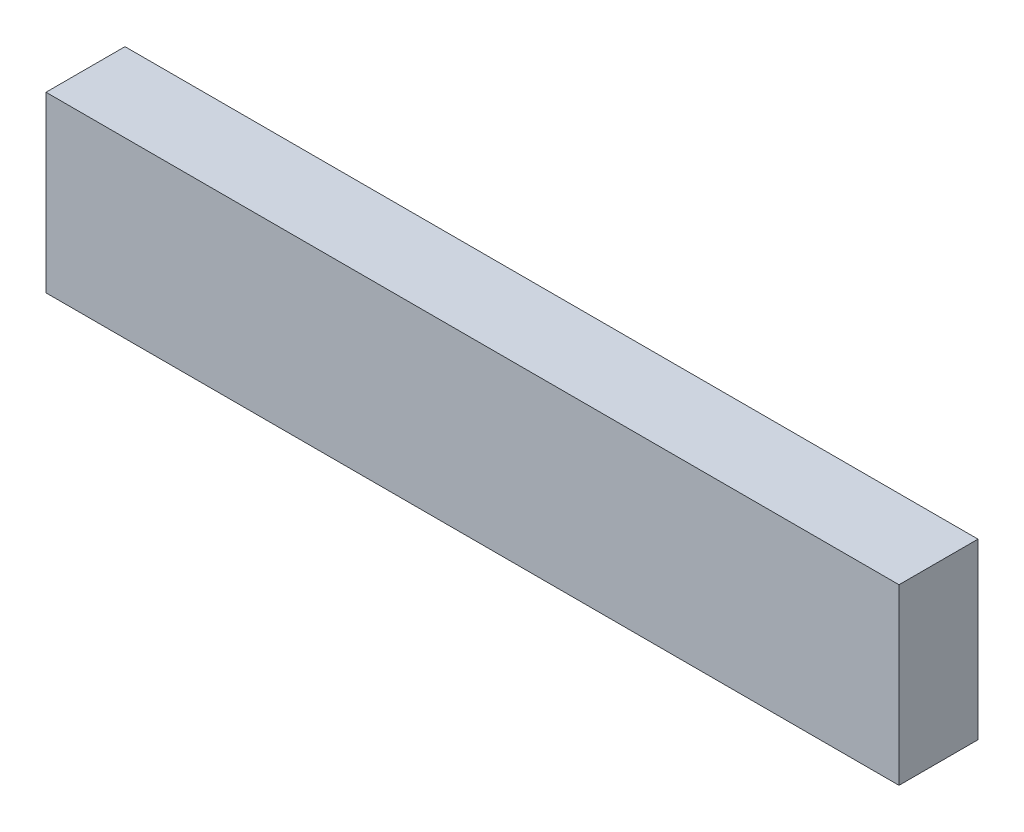
ISO-10303-21;
HEADER;
FILE_DESCRIPTION(('STEP AP214'),'2;1');
FILE_NAME('part.step','',(''),(''),'','','');
FILE_SCHEMA(('AUTOMOTIVE_DESIGN { 1 0 10303 214 1 1 1 1 }'));
ENDSEC;
DATA;
#1=APPLICATION_CONTEXT('core data for automotive mechanical design processes');
#2=APPLICATION_PROTOCOL_DEFINITION('international standard','automotive_design',2000,#1);
#3=PRODUCT_CONTEXT('',#1,'mechanical');
#4=PRODUCT('Part','Part','',(#3));
#5=PRODUCT_RELATED_PRODUCT_CATEGORY('part','',(#4));
#6=PRODUCT_DEFINITION_FORMATION('','',#4);
#7=PRODUCT_DEFINITION_CONTEXT('part definition',#1,'design');
#8=PRODUCT_DEFINITION('design','',#6,#7);
#9=PRODUCT_DEFINITION_SHAPE('','',#8);
#10=(LENGTH_UNIT() NAMED_UNIT(*) SI_UNIT(.MILLI.,.METRE.));
#11=(NAMED_UNIT(*) PLANE_ANGLE_UNIT() SI_UNIT($,.RADIAN.));
#12=(NAMED_UNIT(*) SI_UNIT($,.STERADIAN.) SOLID_ANGLE_UNIT());
#13=UNCERTAINTY_MEASURE_WITH_UNIT(LENGTH_MEASURE(1.E-05),#10,'distance_accuracy_value','');
#14=(GEOMETRIC_REPRESENTATION_CONTEXT(3) GLOBAL_UNCERTAINTY_ASSIGNED_CONTEXT((#13)) GLOBAL_UNIT_ASSIGNED_CONTEXT((#10,
#11,#12)) REPRESENTATION_CONTEXT('',''));
#15=CARTESIAN_POINT('',(0.,0.,0.));
#16=DIRECTION('',(0.,0.,1.));
#17=DIRECTION('',(1.,0.,0.));
#18=AXIS2_PLACEMENT_3D('',#15,#16,#17);
#19=CARTESIAN_POINT('',(-52.6917908156987,25.9721947637664,25.));
#20=DIRECTION('',(1.,0.,0.));
#21=DIRECTION('',(0.,1.,0.));
#22=AXIS2_PLACEMENT_3D('',#19,#20,#21);
#23=PLANE('',#22);
#24=DIRECTION('',(0.,-1.,0.));
#25=VECTOR('',#24,1.);
#26=CARTESIAN_POINT('',(-52.6917908156987,25.9721947637664,0.));
#27=LINE('',#26,#25);
#28=CARTESIAN_POINT('',(-52.6917908156987,25.9721947637664,0.));
#29=VERTEX_POINT('',#28);
#30=CARTESIAN_POINT('',(-52.6917908156987,-29.0278052362336,0.));
#31=VERTEX_POINT('',#30);
#32=EDGE_CURVE('E95',#29,#31,#27,.T.);
#33=ORIENTED_EDGE('',*,*,#32,.T.);
#34=DIRECTION('',(0.,0.,-1.));
#35=VECTOR('',#34,1.);
#36=CARTESIAN_POINT('',(-52.6917908156987,-29.0278052362336,25.));
#37=LINE('',#36,#35);
#38=CARTESIAN_POINT('',(-52.6917908156987,-29.0278052362336,25.));
#39=VERTEX_POINT('',#38);
#40=EDGE_CURVE('E11',#39,#31,#37,.T.);
#41=ORIENTED_EDGE('',*,*,#40,.F.);
#42=DIRECTION('',(0.,-1.,0.));
#43=VECTOR('',#42,1.);
#44=CARTESIAN_POINT('',(-52.6917908156987,25.9721947637664,25.));
#45=LINE('',#44,#43);
#46=CARTESIAN_POINT('',(-52.6917908156987,25.9721947637664,25.));
#47=VERTEX_POINT('',#46);
#48=EDGE_CURVE('E83',#47,#39,#45,.T.);
#49=ORIENTED_EDGE('',*,*,#48,.F.);
#50=DIRECTION('',(0.,0.,-1.));
#51=VECTOR('',#50,1.);
#52=CARTESIAN_POINT('',(-52.6917908156987,25.9721947637664,25.));
#53=LINE('',#52,#51);
#54=EDGE_CURVE('E91',#47,#29,#53,.T.);
#55=ORIENTED_EDGE('',*,*,#54,.T.);
#56=EDGE_LOOP('',(#33,#41,#49,#55));
#57=FACE_BOUND('',#56,.T.);
#58=ADVANCED_FACE('F32',(#57),#23,.F.);
#59=CARTESIAN_POINT('',(-52.6917908156987,-29.0278052362336,25.));
#60=DIRECTION('',(0.,1.,0.));
#61=DIRECTION('',(0.,0.,1.));
#62=AXIS2_PLACEMENT_3D('',#59,#60,#61);
#63=PLANE('',#62);
#64=DIRECTION('',(1.,0.,0.));
#65=VECTOR('',#64,1.);
#66=CARTESIAN_POINT('',(-52.6917908156987,-29.0278052362336,0.));
#67=LINE('',#66,#65);
#68=CARTESIAN_POINT('',(217.308209184301,-29.0278052362336,0.));
#69=VERTEX_POINT('',#68);
#70=EDGE_CURVE('E87',#31,#69,#67,.T.);
#71=ORIENTED_EDGE('',*,*,#70,.T.);
#72=DIRECTION('',(0.,0.,-1.));
#73=VECTOR('',#72,1.);
#74=CARTESIAN_POINT('',(217.308209184301,-29.0278052362336,25.));
#75=LINE('',#74,#73);
#76=CARTESIAN_POINT('',(217.308209184301,-29.0278052362336,25.));
#77=VERTEX_POINT('',#76);
#78=EDGE_CURVE('E40',#77,#69,#75,.T.);
#79=ORIENTED_EDGE('',*,*,#78,.F.);
#80=DIRECTION('',(1.,0.,0.));
#81=VECTOR('',#80,1.);
#82=CARTESIAN_POINT('',(-52.6917908156987,-29.0278052362336,25.));
#83=LINE('',#82,#81);
#84=EDGE_CURVE('E78',#39,#77,#83,.T.);
#85=ORIENTED_EDGE('',*,*,#84,.F.);
#86=ORIENTED_EDGE('',*,*,#40,.T.);
#87=EDGE_LOOP('',(#71,#79,#85,#86));
#88=FACE_BOUND('',#87,.T.);
#89=ADVANCED_FACE('F86',(#88),#63,.F.);
#90=CARTESIAN_POINT('',(217.308209184301,25.9721947637664,25.));
#91=DIRECTION('',(-1.,0.,0.));
#92=DIRECTION('',(0.,-1.,0.));
#93=AXIS2_PLACEMENT_3D('',#90,#91,#92);
#94=PLANE('',#93);
#95=DIRECTION('',(0.,1.,0.));
#96=VECTOR('',#95,1.);
#97=CARTESIAN_POINT('',(217.308209184301,25.9721947637664,0.));
#98=LINE('',#97,#96);
#99=CARTESIAN_POINT('',(217.308209184301,25.9721947637664,0.));
#100=VERTEX_POINT('',#99);
#101=EDGE_CURVE('E65',#69,#100,#98,.T.);
#102=ORIENTED_EDGE('',*,*,#101,.T.);
#103=DIRECTION('',(0.,0.,-1.));
#104=VECTOR('',#103,1.);
#105=CARTESIAN_POINT('',(217.308209184301,25.9721947637664,25.));
#106=LINE('',#105,#104);
#107=CARTESIAN_POINT('',(217.308209184301,25.9721947637664,25.));
#108=VERTEX_POINT('',#107);
#109=EDGE_CURVE('E88',#108,#100,#106,.T.);
#110=ORIENTED_EDGE('',*,*,#109,.F.);
#111=DIRECTION('',(0.,1.,0.));
#112=VECTOR('',#111,1.);
#113=CARTESIAN_POINT('',(217.308209184301,25.9721947637664,25.));
#114=LINE('',#113,#112);
#115=EDGE_CURVE('E81',#77,#108,#114,.T.);
#116=ORIENTED_EDGE('',*,*,#115,.F.);
#117=ORIENTED_EDGE('',*,*,#78,.T.);
#118=EDGE_LOOP('',(#102,#110,#116,#117));
#119=FACE_BOUND('',#118,.T.);
#120=ADVANCED_FACE('F89',(#119),#94,.F.);
#121=CARTESIAN_POINT('',(-52.6917908156987,25.9721947637664,25.));
#122=DIRECTION('',(0.,-1.,0.));
#123=DIRECTION('',(0.,0.,-1.));
#124=AXIS2_PLACEMENT_3D('',#121,#122,#123);
#125=PLANE('',#124);
#126=DIRECTION('',(-1.,0.,0.));
#127=VECTOR('',#126,1.);
#128=CARTESIAN_POINT('',(-52.6917908156987,25.9721947637664,0.));
#129=LINE('',#128,#127);
#130=EDGE_CURVE('E71',#100,#29,#129,.T.);
#131=ORIENTED_EDGE('',*,*,#130,.T.);
#132=ORIENTED_EDGE('',*,*,#54,.F.);
#133=DIRECTION('',(-1.,0.,0.));
#134=VECTOR('',#133,1.);
#135=CARTESIAN_POINT('',(-52.6917908156987,25.9721947637664,25.));
#136=LINE('',#135,#134);
#137=EDGE_CURVE('E48',#108,#47,#136,.T.);
#138=ORIENTED_EDGE('',*,*,#137,.F.);
#139=ORIENTED_EDGE('',*,*,#109,.T.);
#140=EDGE_LOOP('',(#131,#132,#138,#139));
#141=FACE_BOUND('',#140,.T.);
#142=ADVANCED_FACE('F102',(#141),#125,.F.);
#143=CARTESIAN_POINT('',(-52.6917908156987,-29.0278052362336,25.));
#144=DIRECTION('',(0.,0.,1.));
#145=DIRECTION('',(1.,0.,0.));
#146=AXIS2_PLACEMENT_3D('',#143,#144,#145);
#147=PLANE('',#146);
#148=ORIENTED_EDGE('',*,*,#48,.T.);
#149=ORIENTED_EDGE('',*,*,#84,.T.);
#150=ORIENTED_EDGE('',*,*,#115,.T.);
#151=ORIENTED_EDGE('',*,*,#137,.T.);
#152=EDGE_LOOP('',(#148,#149,#150,#151));
#153=FACE_BOUND('',#152,.T.);
#154=ADVANCED_FACE('F79',(#153),#147,.T.);
#155=CARTESIAN_POINT('',(-52.6917908156987,-29.0278052362336,0.));
#156=DIRECTION('',(0.,0.,1.));
#157=DIRECTION('',(1.,0.,0.));
#158=AXIS2_PLACEMENT_3D('',#155,#156,#157);
#159=PLANE('',#158);
#160=ORIENTED_EDGE('',*,*,#32,.F.);
#161=ORIENTED_EDGE('',*,*,#130,.F.);
#162=ORIENTED_EDGE('',*,*,#101,.F.);
#163=ORIENTED_EDGE('',*,*,#70,.F.);
#164=EDGE_LOOP('',(#160,#161,#162,#163));
#165=FACE_BOUND('',#164,.T.);
#166=ADVANCED_FACE('F105',(#165),#159,.F.);
#167=CLOSED_SHELL('',(#58,#89,#120,#142,#154,#166));
#168=MANIFOLD_SOLID_BREP('B2',#167);
#169=ADVANCED_BREP_SHAPE_REPRESENTATION('',(#18,#168),#14);
#170=SHAPE_DEFINITION_REPRESENTATION(#9,#169);
ENDSEC;
END-ISO-10303-21;
